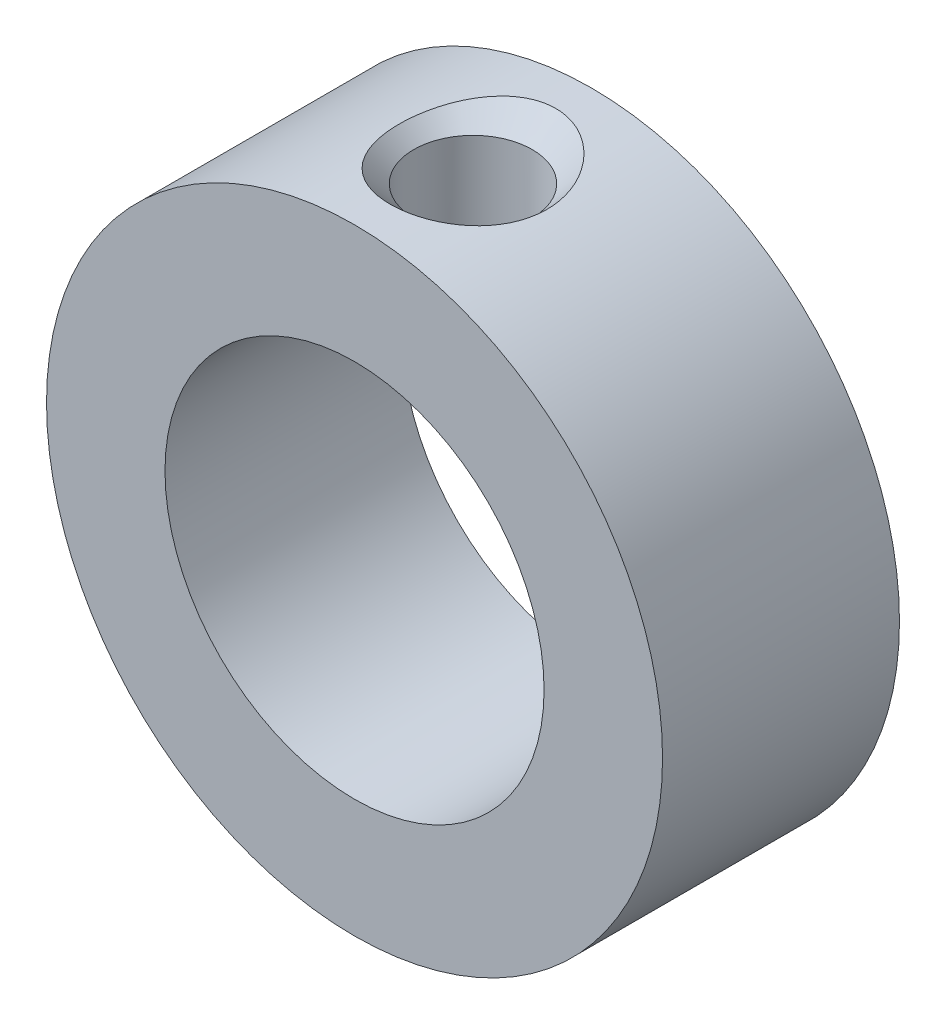
ISO-10303-21;
HEADER;
FILE_DESCRIPTION(('STEP AP214'),'2;1');
FILE_NAME('part.step','',(''),(''),'','','');
FILE_SCHEMA(('AUTOMOTIVE_DESIGN { 1 0 10303 214 1 1 1 1 }'));
ENDSEC;
DATA;
#1=APPLICATION_CONTEXT('core data for automotive mechanical design processes');
#2=APPLICATION_PROTOCOL_DEFINITION('international standard','automotive_design',2000,#1);
#3=PRODUCT_CONTEXT('',#1,'mechanical');
#4=PRODUCT('Part','Part','',(#3));
#5=PRODUCT_RELATED_PRODUCT_CATEGORY('part','',(#4));
#6=PRODUCT_DEFINITION_FORMATION('','',#4);
#7=PRODUCT_DEFINITION_CONTEXT('part definition',#1,'design');
#8=PRODUCT_DEFINITION('design','',#6,#7);
#9=PRODUCT_DEFINITION_SHAPE('','',#8);
#10=(LENGTH_UNIT() NAMED_UNIT(*) SI_UNIT(.MILLI.,.METRE.));
#11=(NAMED_UNIT(*) PLANE_ANGLE_UNIT() SI_UNIT($,.RADIAN.));
#12=(NAMED_UNIT(*) SI_UNIT($,.STERADIAN.) SOLID_ANGLE_UNIT());
#13=UNCERTAINTY_MEASURE_WITH_UNIT(LENGTH_MEASURE(1.E-05),#10,'distance_accuracy_value','');
#14=(GEOMETRIC_REPRESENTATION_CONTEXT(3) GLOBAL_UNCERTAINTY_ASSIGNED_CONTEXT((#13)) GLOBAL_UNIT_ASSIGNED_CONTEXT((#10,
#11,#12)) REPRESENTATION_CONTEXT('',''));
#15=CARTESIAN_POINT('',(0.,0.,0.));
#16=DIRECTION('',(0.,0.,1.));
#17=DIRECTION('',(1.,0.,0.));
#18=AXIS2_PLACEMENT_3D('',#15,#16,#17);
#19=CARTESIAN_POINT('',(0.,0.,7.9375));
#20=DIRECTION('',(0.,0.,-1.));
#21=DIRECTION('',(-1.,0.,0.));
#22=AXIS2_PLACEMENT_3D('',#19,#20,#21);
#23=CYLINDRICAL_SURFACE('',#22,20.6375);
#24=CARTESIAN_POINT('',(0.,0.,7.9375));
#25=DIRECTION('',(0.,0.,1.));
#26=DIRECTION('',(1.,0.,0.));
#27=AXIS2_PLACEMENT_3D('',#24,#25,#26);
#28=CIRCLE('',#27,20.6375);
#29=CARTESIAN_POINT('',(20.6375,0.,7.9375));
#30=VERTEX_POINT('',#29);
#31=EDGE_CURVE('E10',#30,#30,#28,.T.);
#32=ORIENTED_EDGE('',*,*,#31,.F.);
#33=EDGE_LOOP('',(#32));
#34=FACE_BOUND('',#33,.T.);
#35=CARTESIAN_POINT('',(0.,0.,-7.9375));
#36=DIRECTION('',(0.,0.,1.));
#37=DIRECTION('',(1.,0.,0.));
#38=AXIS2_PLACEMENT_3D('',#35,#36,#37);
#39=CIRCLE('',#38,20.6375);
#40=CARTESIAN_POINT('',(20.6375,0.,-7.9375));
#41=VERTEX_POINT('',#40);
#42=EDGE_CURVE('E42',#41,#41,#39,.T.);
#43=ORIENTED_EDGE('',*,*,#42,.T.);
#44=EDGE_LOOP('',(#43));
#45=FACE_BOUND('',#44,.T.);
#46=CARTESIAN_POINT('',(-2.70203889838273,20.4598491197006,-4.65062380390998));
#47=CARTESIAN_POINT('',(-2.91565259457477,20.4316378588335,-4.4938779945163));
#48=CARTESIAN_POINT('',(-3.11662615407159,20.4016835307295,-4.32004163426105));
#49=CARTESIAN_POINT('',(-3.49010599614079,20.3411282983255,-3.9439821520651));
#50=CARTESIAN_POINT('',(-3.66257142045834,20.3105265357172,-3.74171904313066));
#51=CARTESIAN_POINT('',(-3.99438228101539,20.2480362607971,-3.29035292437535));
#52=CARTESIAN_POINT('',(-4.15009411346161,20.2163875826759,-3.03854101166031));
#53=CARTESIAN_POINT('',(-4.42145865059291,20.1587793921417,-2.51367025747271));
#54=CARTESIAN_POINT('',(-4.53710433358896,20.1328208772359,-2.24060770203228));
#55=CARTESIAN_POINT('',(-4.73564741685481,20.0870970536178,-1.65406097629672));
#56=CARTESIAN_POINT('',(-4.81457519059487,20.0681167580824,-1.33916525404645));
#57=CARTESIAN_POINT('',(-4.9218060071168,20.0420877578245,-0.700370558935315));
#58=CARTESIAN_POINT('',(-4.95009689917446,20.0350419168913,-0.376469444088818));
#59=CARTESIAN_POINT('',(-4.9556788537251,20.0336645175484,0.283396410463524));
#60=CARTESIAN_POINT('',(-4.93111622667487,20.0397950758411,0.619379650446819));
#61=CARTESIAN_POINT('',(-4.82758020262637,20.0649860494967,1.2824084525635));
#62=CARTESIAN_POINT('',(-4.74859932706317,20.0840482420166,1.60945277982091));
#63=CARTESIAN_POINT('',(-4.53734401185401,20.1328248485448,2.24563151252476));
#64=CARTESIAN_POINT('',(-4.40498746621398,20.1625556659406,2.5547374821835));
#65=CARTESIAN_POINT('',(-4.08899656369889,20.2290011285622,3.14489743636974));
#66=CARTESIAN_POINT('',(-3.90535781785721,20.2657163714616,3.42594901707762));
#67=CARTESIAN_POINT('',(-3.49695194545271,20.3400897743015,3.94077197680976));
#68=CARTESIAN_POINT('',(-3.27379577430666,20.3776734127337,4.17582614681055));
#69=CARTESIAN_POINT('',(-2.78683865587001,20.4499439042812,4.59990390751403));
#70=CARTESIAN_POINT('',(-2.52307070878918,20.4846330743985,4.78896455254025));
#71=CARTESIAN_POINT('',(-1.99055316400232,20.542841328894,5.09414849383131));
#72=CARTESIAN_POINT('',(-1.72502590251151,20.5671367507609,5.21572676483853));
#73=CARTESIAN_POINT('',(-1.17502136017902,20.6058562409832,5.40598130455632));
#74=CARTESIAN_POINT('',(-0.890566444054737,20.6202917401587,5.47471884430586));
#75=CARTESIAN_POINT('',(-0.349897836918525,20.6360793032868,5.54964259112892));
#76=CARTESIAN_POINT('',(-0.0946525759591097,20.6388530496268,5.56263022982925));
#77=CARTESIAN_POINT('',(0.414099365274375,20.6349107574072,5.54404061133904));
#78=CARTESIAN_POINT('',(0.667606511540191,20.6281973710154,5.51247580897396));
#79=CARTESIAN_POINT('',(1.15243320269344,20.6066570995474,5.40927528278041));
#80=CARTESIAN_POINT('',(1.38422676659422,20.5922569336751,5.33974298275075));
#81=CARTESIAN_POINT('',(1.83355546191301,20.5571234086714,5.16537087644266));
#82=CARTESIAN_POINT('',(2.0510882517456,20.536389012622,5.06052528906635));
#83=CARTESIAN_POINT('',(2.47927398307426,20.4892321088378,4.81284297346012));
#84=CARTESIAN_POINT('',(2.68884885847254,20.4625549517826,4.66819865492885));
#85=CARTESIAN_POINT('',(3.08366247909583,20.4067946629536,4.34927003557764));
#86=CARTESIAN_POINT('',(3.26889089866577,20.3777105188119,4.17497323018367));
#87=CARTESIAN_POINT('',(3.63243425165776,20.3162417661879,3.78015325223363));
#88=CARTESIAN_POINT('',(3.80747638527596,20.2838641707551,3.55661570226911));
#89=CARTESIAN_POINT('',(4.1219387098577,20.2223082143639,3.08536703871996));
#90=CARTESIAN_POINT('',(4.26134232481223,20.1931313457003,2.83764475020416));
#91=CARTESIAN_POINT('',(4.5159211266455,20.1378179160797,2.29635132884871));
#92=CARTESIAN_POINT('',(4.62686670016623,20.1123477821602,2.00071612588962));
#93=CARTESIAN_POINT('',(4.80145775410191,20.0713842872164,1.39513284057851));
#94=CARTESIAN_POINT('',(4.86509045719237,20.0558936214003,1.08518091583537));
#95=CARTESIAN_POINT('',(4.94627737103197,20.0360345043161,0.441546529488615));
#96=CARTESIAN_POINT('',(4.96110548807201,20.0323244619876,0.107496353898603));
#97=CARTESIAN_POINT('',(4.93677943870985,20.0383318711537,-0.558535055714519));
#98=CARTESIAN_POINT('',(4.89761802525114,20.0480511252735,-0.890516005974903));
#99=CARTESIAN_POINT('',(4.76521511160324,20.0799351286034,-1.546815720463));
#100=CARTESIAN_POINT('',(4.67137323872092,20.1022379535138,-1.87100714138182));
#101=CARTESIAN_POINT('',(4.43062813124687,20.1566641187341,-2.49830697858319));
#102=CARTESIAN_POINT('',(4.28371637707041,20.1887890357083,-2.80141200043351));
#103=CARTESIAN_POINT('',(3.94209186255943,20.2582345475497,-3.37171822472899));
#104=CARTESIAN_POINT('',(3.74824255479283,20.2954565336204,-3.6394462474085));
#105=CARTESIAN_POINT('',(3.31482547564657,20.3707296051278,-4.13490211784573));
#106=CARTESIAN_POINT('',(3.0752754462848,20.4087803637554,-4.36264542287241));
#107=CARTESIAN_POINT('',(2.57516548103066,20.4776305593411,-4.75192705264856));
#108=CARTESIAN_POINT('',(2.31758053734064,20.5087611771147,-4.91717853589019));
#109=CARTESIAN_POINT('',(1.91082375784145,20.5493023698206,-5.12556864201784));
#110=CARTESIAN_POINT('',(1.7718369727604,20.5617906038806,-5.18845216348429));
#111=CARTESIAN_POINT('',(1.48814588972596,20.5842679768923,-5.30016408624227));
#112=CARTESIAN_POINT('',(1.34344251220472,20.5942575162768,-5.34899473979019));
#113=CARTESIAN_POINT('',(0.940613768004367,20.61763773959,-5.46233449029901));
#114=CARTESIAN_POINT('',(0.677844930946282,20.6280694370739,-5.51167832074634));
#115=CARTESIAN_POINT('',(0.147672471839748,20.6386743892447,-5.5618374693215));
#116=CARTESIAN_POINT('',(-0.119728988401894,20.6388523063772,-5.56267484358038));
#117=CARTESIAN_POINT('',(-0.626846215151154,20.6294013214667,-5.51798019315671));
#118=CARTESIAN_POINT('',(-0.86694496945734,20.6206251499739,-5.47648014765895));
#119=CARTESIAN_POINT('',(-1.33671755333084,20.5955063586763,-5.35526214391447));
#120=CARTESIAN_POINT('',(-1.56639732301083,20.5791681112678,-5.27556626957262));
#121=CARTESIAN_POINT('',(-1.9498937846575,20.5458224246059,-5.10788691496353));
#122=CARTESIAN_POINT('',(-2.10743536678437,20.5301895775074,-5.02796633846425));
#123=CARTESIAN_POINT('',(-2.41252401892708,20.4965771993812,-4.85141925746831));
#124=CARTESIAN_POINT('',(-2.5600729232574,20.4785981008282,-4.75479583067637));
#125=CARTESIAN_POINT('',(-2.70203889838273,20.4598491197006,-4.65062380390998));
#126=B_SPLINE_CURVE_WITH_KNOTS('',3,(#46,#47,#48,#49,#50,#51,#52,#53,#54,#55,#56,#57,#58,#59,
#60,#61,#62,#63,#64,#65,#66,#67,#68,#69,#70,#71,#72,#73,#74,#75,#76,#77,#78,#79,#80,#81,#82,#83,
#84,#85,#86,#87,#88,#89,#90,#91,#92,#93,#94,#95,#96,#97,#98,#99,#100,#101,#102,#103,#104,#105,
#106,#107,#108,#109,#110,#111,#112,#113,#114,#115,#116,#117,#118,#119,#120,#121,#122,#123,#124,
#125),.UNSPECIFIED.,.T.,.F.,(4,2,2,2,2,2,2,2,2,2,2,2,2,2,2,2,2,2,2,2,2,2,2,2,2,2,2,2,2,2,2,2,2,
2,2,2,2,2,2,4),(0.,0.798794839173173,1.59872477792347,2.48825859865597,3.37794823356569,
4.34912604535624,5.320536867793,6.32657097534831,7.33274336725954,8.34046946035589,
9.34828182573314,10.3218228549913,11.2945769416346,12.1686082010195,13.0416244494591,
13.804423597664,14.5670095443348,15.2910964628001,16.01530197837,16.7803083979599,
17.5456382271755,18.3994144349343,19.2535870272803,20.1998048306787,21.1462780771494,
22.1447946505044,23.1434452685631,24.1532730425247,25.1632630015,26.1559229310091,
27.1481982695994,28.0651540628394,28.5236604291958,28.9820932696543,29.7799902952835,
30.5775245102485,31.3056011350723,32.0332573104914,32.5642277845426,33.095100524867),.UNSPECIFIED.);
#127=CARTESIAN_POINT('',(-2.70203889838273,20.4598491197006,-4.65062380390998));
#128=VERTEX_POINT('',#127);
#129=EDGE_CURVE('E35',#128,#128,#126,.T.);
#130=ORIENTED_EDGE('',*,*,#129,.F.);
#131=EDGE_LOOP('',(#130));
#132=FACE_BOUND('',#131,.T.);
#133=ADVANCED_FACE('F31',(#34,#45,#132),#23,.T.);
#134=CARTESIAN_POINT('',(0.,0.,7.9375));
#135=DIRECTION('',(0.,0.,-1.));
#136=DIRECTION('',(-1.,0.,0.));
#137=AXIS2_PLACEMENT_3D('',#134,#135,#136);
#138=CYLINDRICAL_SURFACE('',#137,12.7);
#139=CARTESIAN_POINT('',(0.,0.,-7.9375));
#140=DIRECTION('',(0.,0.,1.));
#141=DIRECTION('',(1.,0.,0.));
#142=AXIS2_PLACEMENT_3D('',#139,#140,#141);
#143=CIRCLE('',#142,12.7);
#144=CARTESIAN_POINT('',(12.7,0.,-7.9375));
#145=VERTEX_POINT('',#144);
#146=EDGE_CURVE('E50',#145,#145,#143,.T.);
#147=ORIENTED_EDGE('',*,*,#146,.F.);
#148=EDGE_LOOP('',(#147));
#149=FACE_BOUND('',#148,.T.);
#150=CARTESIAN_POINT('',(0.,0.,7.9375));
#151=DIRECTION('',(0.,0.,1.));
#152=DIRECTION('',(1.,0.,0.));
#153=AXIS2_PLACEMENT_3D('',#150,#151,#152);
#154=CIRCLE('',#153,12.7);
#155=CARTESIAN_POINT('',(12.7,0.,7.9375));
#156=VERTEX_POINT('',#155);
#157=EDGE_CURVE('E47',#156,#156,#154,.T.);
#158=ORIENTED_EDGE('',*,*,#157,.T.);
#159=EDGE_LOOP('',(#158));
#160=FACE_BOUND('',#159,.T.);
#161=CARTESIAN_POINT('',(3.96875,12.0639555468967,0.));
#162=CARTESIAN_POINT('',(3.96874853251649,12.0639568842915,-0.217001839647144));
#163=CARTESIAN_POINT('',(3.95089185662995,12.0698746252851,-0.434018590632661));
#164=CARTESIAN_POINT('',(3.88014131899213,12.0928015382143,-0.861676460787038));
#165=CARTESIAN_POINT('',(3.82723798884485,12.1098137074621,-1.07231584092461));
#166=CARTESIAN_POINT('',(3.68839077609799,12.1528185580417,-1.4809625636341));
#167=CARTESIAN_POINT('',(3.60250535963949,12.1787953399196,-1.67899154011053));
#168=CARTESIAN_POINT('',(3.40032702499773,12.2367803974434,-2.05788480936824));
#169=CARTESIAN_POINT('',(3.28402873500381,12.2687897383379,-2.23874606212339));
#170=CARTESIAN_POINT('',(3.02004752422578,12.3364665534787,-2.58438290429182));
#171=CARTESIAN_POINT('',(2.87149984411226,12.3722169174668,-2.74848195995925));
#172=CARTESIAN_POINT('',(2.54908699749619,12.4426423060657,-3.04989234193917));
#173=CARTESIAN_POINT('',(2.37521830174644,12.4773171799559,-3.18719992779989));
#174=CARTESIAN_POINT('',(2.00223727216642,12.542632820135,-3.4341151250607));
#175=CARTESIAN_POINT('',(1.8026429419513,12.5731646098683,-3.54302600966488));
#176=CARTESIAN_POINT('',(1.38685343930955,12.6257860206983,-3.72546895829137));
#177=CARTESIAN_POINT('',(1.17066218269639,12.6478776258325,-3.79900933792493));
#178=CARTESIAN_POINT('',(0.734899333367359,12.6805428323124,-3.90636483170819));
#179=CARTESIAN_POINT('',(0.515638146611584,12.6914509627465,-3.94133625557643));
#180=CARTESIAN_POINT('',(0.0741070844008477,12.7017016690635,-3.97422479993914));
#181=CARTESIAN_POINT('',(-0.148162095639551,12.7010468740197,-3.97215034358927));
#182=CARTESIAN_POINT('',(-0.581261475126274,12.6884784372079,-3.93176667421464));
#183=CARTESIAN_POINT('',(-0.792221663947056,12.6769542933654,-3.89471095734622));
#184=CARTESIAN_POINT('',(-1.2047634761292,12.6444210713078,-3.78747340661341));
#185=CARTESIAN_POINT('',(-1.40634448690292,12.6234113745139,-3.71728941234996));
#186=CARTESIAN_POINT('',(-1.7972979775163,12.5737448464102,-3.54498214968747));
#187=CARTESIAN_POINT('',(-1.986490837852,12.5449975673293,-3.44247848281325));
#188=CARTESIAN_POINT('',(-2.34538047290818,12.4828847037847,-3.20874675843714));
#189=CARTESIAN_POINT('',(-2.51507230096487,12.4495179522495,-3.07751143723408));
#190=CARTESIAN_POINT('',(-2.83761719258918,12.3800765457896,-2.78360620950932));
#191=CARTESIAN_POINT('',(-2.98947379336682,12.3439469905188,-2.61985420644223));
#192=CARTESIAN_POINT('',(-3.26386743274752,12.2742520403678,-2.26887055169429));
#193=CARTESIAN_POINT('',(-3.38640101789399,12.2406869478284,-2.08163613837562));
#194=CARTESIAN_POINT('',(-3.59982976435593,12.1796443805944,-1.68618703640895));
#195=CARTESIAN_POINT('',(-3.69035586221749,12.1522391668376,-1.47776117645366));
#196=CARTESIAN_POINT('',(-3.83471248377107,12.1074670626035,-1.04756111340163));
#197=CARTESIAN_POINT('',(-3.88855619178879,12.090096565806,-0.825791737432857));
#198=CARTESIAN_POINT('',(-3.95609715466835,12.0681611381736,-0.384746650567579));
#199=CARTESIAN_POINT('',(-3.97132030073623,12.0631098080018,-0.165728661953452));
#200=CARTESIAN_POINT('',(-3.96547163781533,12.0650342093526,0.271747429247065));
#201=CARTESIAN_POINT('',(-3.94440543703716,12.0720080824823,0.490205613121441));
#202=CARTESIAN_POINT('',(-3.86793973404381,12.0967169001143,0.913791341871444));
#203=CARTESIAN_POINT('',(-3.81355063934747,12.1141348427389,1.11912169518559));
#204=CARTESIAN_POINT('',(-3.67316936373721,12.1574333727714,1.51771918958678));
#205=CARTESIAN_POINT('',(-3.58717202843405,12.1833153403409,1.7109843571746));
#206=CARTESIAN_POINT('',(-3.38320096332413,12.2415471339902,2.08609917352549));
#207=CARTESIAN_POINT('',(-3.26438093276172,12.2740611607997,2.26746249450711));
#208=CARTESIAN_POINT('',(-2.99912534755837,12.3415535798866,2.60823184969904));
#209=CARTESIAN_POINT('',(-2.85268261914323,12.3765326108584,2.76763216133793));
#210=CARTESIAN_POINT('',(-2.5291191091177,12.4467679551153,3.0667654117732));
#211=CARTESIAN_POINT('',(-2.35097843807855,12.4819756800704,3.20540947099408));
#212=CARTESIAN_POINT('',(-1.97310865744318,12.5472526500367,3.45087906254498));
#213=CARTESIAN_POINT('',(-1.77338053726988,12.5773221303875,3.55770605231254));
#214=CARTESIAN_POINT('',(-1.35923503657856,12.6287629037303,3.73548453584759));
#215=CARTESIAN_POINT('',(-1.14493733510092,12.6501969360681,3.80669573890369));
#216=CARTESIAN_POINT('',(-0.706619281629033,12.6822277040923,3.91183031002232));
#217=CARTESIAN_POINT('',(-0.482601994980629,12.6928278310283,3.9457653465901));
#218=CARTESIAN_POINT('',(-0.0412271738602525,12.7017717580917,3.97443643055505));
#219=CARTESIAN_POINT('',(0.176019434430208,12.7006073586846,3.97074532929216));
#220=CARTESIAN_POINT('',(0.606657479606313,12.6873310540733,3.92807249992039));
#221=CARTESIAN_POINT('',(0.820049166920131,12.6752198626356,3.88909307272557));
#222=CARTESIAN_POINT('',(1.23429750117651,12.6415663743223,3.77795152071927));
#223=CARTESIAN_POINT('',(1.4352775410771,12.6201439227365,3.70621049509095));
#224=CARTESIAN_POINT('',(1.82244500096279,12.5700772724174,3.53196262361308));
#225=CARTESIAN_POINT('',(2.00862987679648,12.5414318351506,3.42945050083436));
#226=CARTESIAN_POINT('',(2.36779338152876,12.4786992260472,3.19254899225641));
#227=CARTESIAN_POINT('',(2.54010987739363,12.444460434593,3.05719631617689));
#228=CARTESIAN_POINT('',(2.86010601269284,12.3748398853692,2.760154851017));
#229=CARTESIAN_POINT('',(3.00777825387571,12.3394577881682,2.59845818210745));
#230=CARTESIAN_POINT('',(3.27923099268227,12.2701650893337,2.24689758950451));
#231=CARTESIAN_POINT('',(3.40205783883207,12.2363420774147,2.05627794510487));
#232=CARTESIAN_POINT('',(3.61379994626556,12.1754939776251,1.65608596814548));
#233=CARTESIAN_POINT('',(3.70272892306258,12.148466141849,1.44652134352045));
#234=CARTESIAN_POINT('',(3.8376599788364,12.1064832939804,1.03275569002592));
#235=CARTESIAN_POINT('',(3.88667433985248,12.090695752639,0.829619411841279));
#236=CARTESIAN_POINT('',(3.95221605466116,12.0694325058162,0.417659083093644));
#237=CARTESIAN_POINT('',(3.96875141226471,12.0639542598257,0.208836446685243));
#238=CARTESIAN_POINT('',(3.96875,12.0639555468967,0.));
#239=B_SPLINE_CURVE_WITH_KNOTS('',3,(#161,#162,#163,#164,#165,#166,#167,#168,#169,#170,#171,
#172,#173,#174,#175,#176,#177,#178,#179,#180,#181,#182,#183,#184,#185,#186,#187,#188,#189,#190,
#191,#192,#193,#194,#195,#196,#197,#198,#199,#200,#201,#202,#203,#204,#205,#206,#207,#208,#209,
#210,#211,#212,#213,#214,#215,#216,#217,#218,#219,#220,#221,#222,#223,#224,#225,#226,#227,#228,
#229,#230,#231,#232,#233,#234,#235,#236,#237,#238),.UNSPECIFIED.,.T.,.F.,(4,2,2,2,2,2,2,2,2,2,2,
2,2,2,2,2,2,2,2,2,2,2,2,2,2,2,2,2,2,2,2,2,2,2,2,2,2,2,4),(0.,0.650234086716457,1.30064391591466,
1.9499060700765,2.59928298063671,3.26888730748912,3.93858505338065,4.62342934734853,
5.30811255551902,5.97165820002819,6.63505297547884,7.27554370928958,7.91607621728546,
8.56444834631699,9.21298458114371,9.88854826126035,10.5641914653574,11.2473889522044,
11.9303407555771,12.5858566319692,13.2412712130333,13.8777336124857,14.5142998466166,
15.1691217226573,15.8241138944544,16.5062515255927,17.1883579053947,17.8654150975664,
18.5422602910408,19.1909319775321,19.8395613715579,20.4800786269208,21.1207057872722,
21.7830620061678,22.4456167093443,23.1301225072563,23.8143510505986,24.4402722513687,
25.0660391868209),.UNSPECIFIED.);
#240=CARTESIAN_POINT('',(3.96875,12.0639555468967,0.));
#241=VERTEX_POINT('',#240);
#242=EDGE_CURVE('E52',#241,#241,#239,.T.);
#243=ORIENTED_EDGE('',*,*,#242,.T.);
#244=EDGE_LOOP('',(#243));
#245=FACE_BOUND('',#244,.T.);
#246=ADVANCED_FACE('F59',(#149,#160,#245),#138,.F.);
#247=CARTESIAN_POINT('',(0.,0.,7.9375));
#248=DIRECTION('',(0.,0.,1.));
#249=DIRECTION('',(1.,0.,0.));
#250=AXIS2_PLACEMENT_3D('',#247,#248,#249);
#251=PLANE('',#250);
#252=ORIENTED_EDGE('',*,*,#31,.T.);
#253=EDGE_LOOP('',(#252));
#254=FACE_BOUND('',#253,.T.);
#255=ORIENTED_EDGE('',*,*,#157,.F.);
#256=EDGE_LOOP('',(#255));
#257=FACE_BOUND('',#256,.T.);
#258=ADVANCED_FACE('F74',(#254,#257),#251,.T.);
#259=CARTESIAN_POINT('',(0.,0.,-7.9375));
#260=DIRECTION('',(0.,0.,1.));
#261=DIRECTION('',(1.,0.,0.));
#262=AXIS2_PLACEMENT_3D('',#259,#260,#261);
#263=PLANE('',#262);
#264=ORIENTED_EDGE('',*,*,#42,.F.);
#265=EDGE_LOOP('',(#264));
#266=FACE_BOUND('',#265,.T.);
#267=ORIENTED_EDGE('',*,*,#146,.T.);
#268=EDGE_LOOP('',(#267));
#269=FACE_BOUND('',#268,.T.);
#270=ADVANCED_FACE('F69',(#266,#269),#263,.F.);
#271=CARTESIAN_POINT('',(0.,24.8790559415004,0.));
#272=DIRECTION('',(0.,1.,0.));
#273=DIRECTION('',(-1.,0.,0.));
#274=AXIS2_PLACEMENT_3D('',#271,#272,#273);
#275=CONICAL_SURFACE('',#274,9.79780594150038,0.785398163397451);
#276=CARTESIAN_POINT('',(0.,19.05,0.));
#277=DIRECTION('',(0.,-1.,0.));
#278=DIRECTION('',(1.,0.,0.));
#279=AXIS2_PLACEMENT_3D('',#276,#277,#278);
#280=CIRCLE('',#279,3.96875);
#281=CARTESIAN_POINT('',(3.96875,19.05,0.));
#282=VERTEX_POINT('',#281);
#283=EDGE_CURVE('E58',#282,#282,#280,.T.);
#284=ORIENTED_EDGE('',*,*,#283,.T.);
#285=EDGE_LOOP('',(#284));
#286=FACE_BOUND('',#285,.T.);
#287=ORIENTED_EDGE('',*,*,#129,.T.);
#288=EDGE_LOOP('',(#287));
#289=FACE_BOUND('',#288,.T.);
#290=ADVANCED_FACE('F65',(#286,#289),#275,.F.);
#291=CARTESIAN_POINT('',(0.,0.,0.));
#292=DIRECTION('',(0.,-1.,0.));
#293=DIRECTION('',(1.,0.,0.));
#294=AXIS2_PLACEMENT_3D('',#291,#292,#293);
#295=CYLINDRICAL_SURFACE('',#294,3.96875);
#296=ORIENTED_EDGE('',*,*,#242,.F.);
#297=EDGE_LOOP('',(#296));
#298=FACE_BOUND('',#297,.T.);
#299=ORIENTED_EDGE('',*,*,#283,.F.);
#300=EDGE_LOOP('',(#299));
#301=FACE_BOUND('',#300,.T.);
#302=ADVANCED_FACE('F62',(#298,#301),#295,.F.);
#303=CLOSED_SHELL('',(#133,#246,#258,#270,#290,#302));
#304=MANIFOLD_SOLID_BREP('B2',#303);
#305=ADVANCED_BREP_SHAPE_REPRESENTATION('',(#18,#304),#14);
#306=SHAPE_DEFINITION_REPRESENTATION(#9,#305);
ENDSEC;
END-ISO-10303-21;
